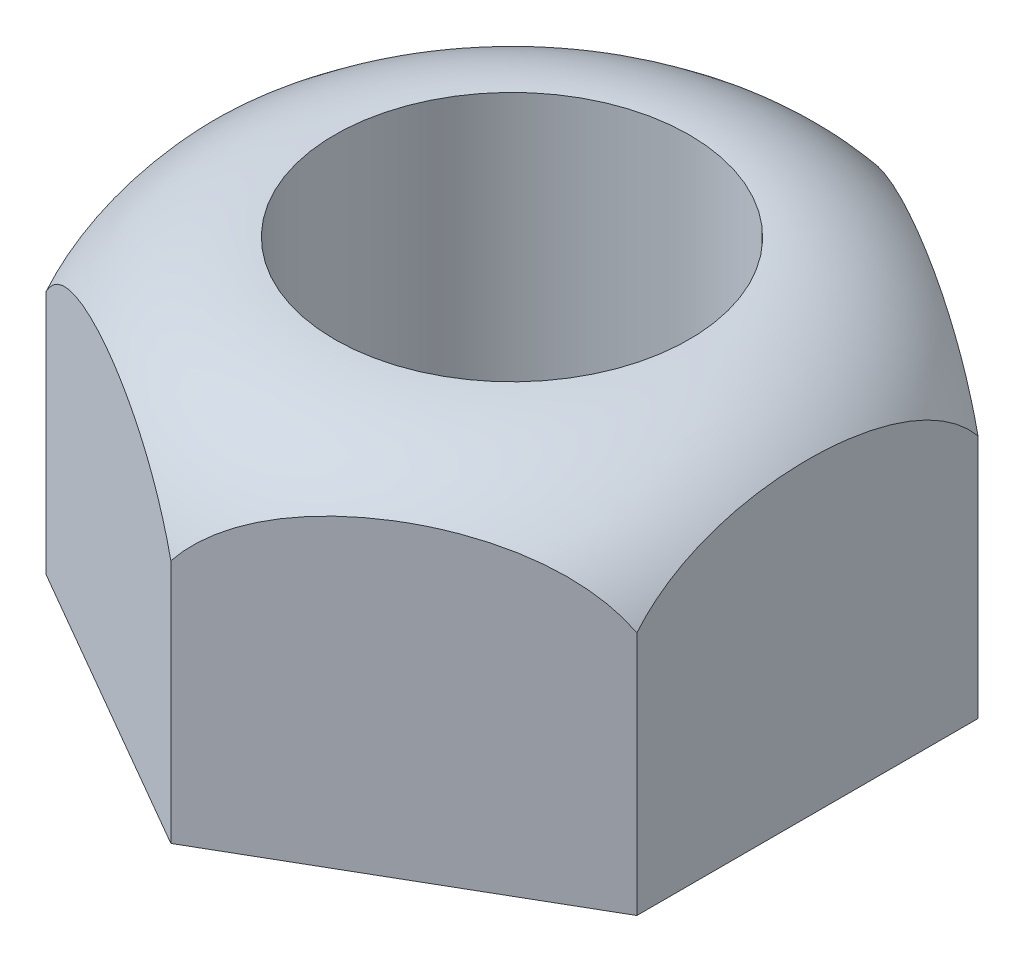
ISO-10303-21;
HEADER;
FILE_DESCRIPTION(('STEP AP214'),'2;1');
FILE_NAME('part.step','',(''),(''),'','','');
FILE_SCHEMA(('AUTOMOTIVE_DESIGN { 1 0 10303 214 1 1 1 1 }'));
ENDSEC;
DATA;
#1=APPLICATION_CONTEXT('core data for automotive mechanical design processes');
#2=APPLICATION_PROTOCOL_DEFINITION('international standard','automotive_design',2000,#1);
#3=PRODUCT_CONTEXT('',#1,'mechanical');
#4=PRODUCT('Part','Part','',(#3));
#5=PRODUCT_RELATED_PRODUCT_CATEGORY('part','',(#4));
#6=PRODUCT_DEFINITION_FORMATION('','',#4);
#7=PRODUCT_DEFINITION_CONTEXT('part definition',#1,'design');
#8=PRODUCT_DEFINITION('design','',#6,#7);
#9=PRODUCT_DEFINITION_SHAPE('','',#8);
#10=(LENGTH_UNIT() NAMED_UNIT(*) SI_UNIT(.MILLI.,.METRE.));
#11=(NAMED_UNIT(*) PLANE_ANGLE_UNIT() SI_UNIT($,.RADIAN.));
#12=(NAMED_UNIT(*) SI_UNIT($,.STERADIAN.) SOLID_ANGLE_UNIT());
#13=UNCERTAINTY_MEASURE_WITH_UNIT(LENGTH_MEASURE(1.E-05),#10,'distance_accuracy_value','');
#14=(GEOMETRIC_REPRESENTATION_CONTEXT(3) GLOBAL_UNCERTAINTY_ASSIGNED_CONTEXT((#13)) GLOBAL_UNIT_ASSIGNED_CONTEXT((#10,
#11,#12)) REPRESENTATION_CONTEXT('',''));
#15=CARTESIAN_POINT('',(0.,0.,0.));
#16=DIRECTION('',(0.,0.,1.));
#17=DIRECTION('',(1.,0.,0.));
#18=AXIS2_PLACEMENT_3D('',#15,#16,#17);
#19=CARTESIAN_POINT('',(0.,-3.,0.));
#20=DIRECTION('',(0.,1.,0.));
#21=DIRECTION('',(0.,0.,1.));
#22=AXIS2_PLACEMENT_3D('',#19,#20,#21);
#23=PLANE('',#22);
#24=DIRECTION('',(0.,0.,-1.));
#25=VECTOR('',#24,1.);
#26=CARTESIAN_POINT('',(4.99999999999999,-3.,2.88675134594813));
#27=LINE('',#26,#25);
#28=CARTESIAN_POINT('',(4.99999999999999,-3.,2.88675134594813));
#29=VERTEX_POINT('',#28);
#30=CARTESIAN_POINT('',(4.99999999999999,-3.,-2.88675134594813));
#31=VERTEX_POINT('',#30);
#32=EDGE_CURVE('E132',#29,#31,#27,.T.);
#33=ORIENTED_EDGE('',*,*,#32,.F.);
#34=DIRECTION('',(0.866025403784439,0.,-0.5));
#35=VECTOR('',#34,1.);
#36=CARTESIAN_POINT('',(0.,-3.,5.77350269189626));
#37=LINE('',#36,#35);
#38=CARTESIAN_POINT('',(0.,-3.,5.77350269189626));
#39=VERTEX_POINT('',#38);
#40=EDGE_CURVE('E121',#39,#29,#37,.T.);
#41=ORIENTED_EDGE('',*,*,#40,.F.);
#42=DIRECTION('',(0.866025403784439,0.,0.5));
#43=VECTOR('',#42,1.);
#44=CARTESIAN_POINT('',(-5.,-3.,2.88675134594813));
#45=LINE('',#44,#43);
#46=CARTESIAN_POINT('',(-5.,-3.,2.88675134594813));
#47=VERTEX_POINT('',#46);
#48=EDGE_CURVE('E123',#47,#39,#45,.T.);
#49=ORIENTED_EDGE('',*,*,#48,.F.);
#50=DIRECTION('',(0.,0.,1.));
#51=VECTOR('',#50,1.);
#52=CARTESIAN_POINT('',(-5.,-3.,-2.88675134594813));
#53=LINE('',#52,#51);
#54=CARTESIAN_POINT('',(-5.,-3.,-2.88675134594813));
#55=VERTEX_POINT('',#54);
#56=EDGE_CURVE('E126',#55,#47,#53,.T.);
#57=ORIENTED_EDGE('',*,*,#56,.F.);
#58=DIRECTION('',(-0.866025403784439,0.,0.5));
#59=VECTOR('',#58,1.);
#60=CARTESIAN_POINT('',(0.,-3.,-5.77350269189626));
#61=LINE('',#60,#59);
#62=CARTESIAN_POINT('',(0.,-3.,-5.77350269189626));
#63=VERTEX_POINT('',#62);
#64=EDGE_CURVE('E129',#63,#55,#61,.T.);
#65=ORIENTED_EDGE('',*,*,#64,.F.);
#66=DIRECTION('',(-0.866025403784439,0.,-0.5));
#67=VECTOR('',#66,1.);
#68=CARTESIAN_POINT('',(4.99999999999999,-3.,-2.88675134594813));
#69=LINE('',#68,#67);
#70=EDGE_CURVE('E112',#31,#63,#69,.T.);
#71=ORIENTED_EDGE('',*,*,#70,.F.);
#72=EDGE_LOOP('',(#33,#41,#49,#57,#65,#71));
#73=FACE_BOUND('',#72,.T.);
#74=CARTESIAN_POINT('',(0.,-3.,0.));
#75=DIRECTION('',(0.,1.,0.));
#76=DIRECTION('',(0.,0.,1.));
#77=AXIS2_PLACEMENT_3D('',#74,#75,#76);
#78=CIRCLE('',#77,3.);
#79=CARTESIAN_POINT('',(0.,-3.,3.));
#80=VERTEX_POINT('',#79);
#81=EDGE_CURVE('E134',#80,#80,#78,.T.);
#82=ORIENTED_EDGE('',*,*,#81,.T.);
#83=EDGE_LOOP('',(#82));
#84=FACE_BOUND('',#83,.T.);
#85=ADVANCED_FACE('F39',(#73,#84),#23,.F.);
#86=CARTESIAN_POINT('',(4.99999999999999,3.,2.88675134594813));
#87=DIRECTION('',(-1.,0.,0.));
#88=DIRECTION('',(0.,0.,1.));
#89=AXIS2_PLACEMENT_3D('',#86,#87,#88);
#90=PLANE('',#89);
#91=DIRECTION('',(0.,-1.,0.));
#92=VECTOR('',#91,1.);
#93=CARTESIAN_POINT('',(4.99999999999999,3.,-2.88675134594813));
#94=LINE('',#93,#92);
#95=CARTESIAN_POINT('',(5.,1.14353960055794,-2.88675134594813));
#96=VERTEX_POINT('',#95);
#97=EDGE_CURVE('E11',#96,#31,#94,.T.);
#98=ORIENTED_EDGE('',*,*,#97,.F.);
#99=CARTESIAN_POINT('',(4.99999999999999,2.23606797749979,0.));
#100=CARTESIAN_POINT('',(4.99999999999999,2.23606547708485,0.120918907635913));
#101=CARTESIAN_POINT('',(4.99999999999999,2.23215695883544,0.241827848779719));
#102=CARTESIAN_POINT('',(4.99999999999999,2.21636735639039,0.483117337858945));
#103=CARTESIAN_POINT('',(4.99999999999999,2.20448748147199,0.603497963153676));
#104=CARTESIAN_POINT('',(4.99999999999999,2.17230957672205,0.843175170668359));
#105=CARTESIAN_POINT('',(4.99999999999999,2.15200965486483,0.962471503081574));
#106=CARTESIAN_POINT('',(4.99999999999999,2.10228318635368,1.19911813128936));
#107=CARTESIAN_POINT('',(4.99999999999999,2.07285946731982,1.31646901815666));
#108=CARTESIAN_POINT('',(4.99999999999999,1.99149257912571,1.59010251201208));
#109=CARTESIAN_POINT('',(4.99999999999999,1.93525457949775,1.74515200180723));
#110=CARTESIAN_POINT('',(4.99999999999999,1.80136991737628,2.04572548254269));
#111=CARTESIAN_POINT('',(4.99999999999999,1.72375539118573,2.19126336952084));
#112=CARTESIAN_POINT('',(4.99999999999999,1.56277118376517,2.43890308689245));
#113=CARTESIAN_POINT('',(4.99999999999999,1.48377397538791,2.54382254430582));
#114=CARTESIAN_POINT('',(4.99999999999999,1.30987699827946,2.7396282799976));
#115=CARTESIAN_POINT('',(4.99999999999999,1.21499717596204,2.83053188858002));
#116=CARTESIAN_POINT('',(4.99999999999999,1.0301159573075,2.97723052563607));
#117=CARTESIAN_POINT('',(4.99999999999999,0.942813107119015,3.0364145149125));
#118=CARTESIAN_POINT('',(4.99999999999999,0.759583936212259,3.13957828549396));
#119=CARTESIAN_POINT('',(4.99999999999999,0.663661656029086,3.18356514439735));
#120=CARTESIAN_POINT('',(4.99999999999999,0.464847484174504,3.25393965352395));
#121=CARTESIAN_POINT('',(4.99999999999999,0.361917437478582,3.28022077701964));
#122=CARTESIAN_POINT('',(4.99999999999999,0.15294111182827,3.31290834387848));
#123=CARTESIAN_POINT('',(4.99999999999999,0.0468962069976227,3.31932342209303));
#124=CARTESIAN_POINT('',(4.99999999999999,-0.153734080318637,3.31222176535418));
#125=CARTESIAN_POINT('',(4.99999999999999,-0.248394487684605,3.30065386765089));
#126=CARTESIAN_POINT('',(4.99999999999999,-0.434404619303879,3.26181910522999));
#127=CARTESIAN_POINT('',(4.99999999999999,-0.525754653885907,3.23455371613119));
#128=CARTESIAN_POINT('',(4.99999999999999,-0.703233395942723,3.16568011577716));
#129=CARTESIAN_POINT('',(4.99999999999999,-0.789340379448156,3.12401645042847));
#130=CARTESIAN_POINT('',(4.99999999999999,-0.954375501924881,3.02836892053913));
#131=CARTESIAN_POINT('',(4.99999999999999,-1.03330025498121,2.97437928682587));
#132=CARTESIAN_POINT('',(4.99999999999999,-1.21217999234046,2.83319578618356));
#133=CARTESIAN_POINT('',(4.99999999999999,-1.30839251775865,2.74125094122274));
#134=CARTESIAN_POINT('',(4.99999999999999,-1.48457457681218,2.54296994059313));
#135=CARTESIAN_POINT('',(4.99999999999999,-1.5645150618035,2.43660860279747));
#136=CARTESIAN_POINT('',(4.99999999999999,-1.73831292997454,2.16830650460945));
#137=CARTESIAN_POINT('',(4.99999999999999,-1.82449575152687,2.0014223589474));
#138=CARTESIAN_POINT('',(4.99999999999999,-1.96979428306982,1.65626349949258));
#139=CARTESIAN_POINT('',(4.99999999999999,-2.0288469548393,1.47796334338487));
#140=CARTESIAN_POINT('',(4.99999999999999,-2.11230706123924,1.15914275681445));
#141=CARTESIAN_POINT('',(4.99999999999999,-2.14163215600666,1.01985771960752));
#142=CARTESIAN_POINT('',(4.99999999999999,-2.18827639288221,0.739223942062745));
#143=CARTESIAN_POINT('',(4.99999999999999,-2.20558839332926,0.597874025064965));
#144=CARTESIAN_POINT('',(4.99999999999999,-2.22908563764715,0.314037780514991));
#145=CARTESIAN_POINT('',(4.99999999999999,-2.2352521116048,0.171549941078096));
#146=CARTESIAN_POINT('',(4.99999999999999,-2.23673283017761,-0.113440619086964));
#147=CARTESIAN_POINT('',(4.99999999999999,-2.23205071801853,-0.255943318753454));
#148=CARTESIAN_POINT('',(4.99999999999999,-2.21317816931042,-0.518018786832451));
#149=CARTESIAN_POINT('',(4.99999999999999,-2.20058157063548,-0.637707348758131));
#150=CARTESIAN_POINT('',(4.99999999999999,-2.16699996802981,-0.875936112436773));
#151=CARTESIAN_POINT('',(4.99999999999999,-2.14601392442707,-0.994476169994405));
#152=CARTESIAN_POINT('',(4.99999999999999,-2.09500227924768,-1.22924960329497));
#153=CARTESIAN_POINT('',(4.99999999999999,-2.06500417832384,-1.34548886578246));
#154=CARTESIAN_POINT('',(4.99999999999999,-1.99503238840018,-1.57487815676775));
#155=CARTESIAN_POINT('',(4.99999999999999,-1.95506445754837,-1.68802992676516));
#156=CARTESIAN_POINT('',(4.99999999999999,-1.85282705434588,-1.93726711187123));
#157=CARTESIAN_POINT('',(4.99999999999999,-1.78748843719083,-2.07212579721777));
#158=CARTESIAN_POINT('',(4.99999999999999,-1.63755093552136,-2.3307739159673));
#159=CARTESIAN_POINT('',(4.99999999999999,-1.55297200147192,-2.45457463159287));
#160=CARTESIAN_POINT('',(4.99999999999999,-1.38203242292518,-2.66253632811602));
#161=CARTESIAN_POINT('',(4.99999999999999,-1.2993405858539,-2.7496924410226));
#162=CARTESIAN_POINT('',(4.99999999999999,-1.12084494282723,-2.909419315686));
#163=CARTESIAN_POINT('',(4.99999999999999,-1.02505637822909,-2.98200679289585));
#164=CARTESIAN_POINT('',(4.99999999999999,-0.838185476698753,-3.0982354091423));
#165=CARTESIAN_POINT('',(4.99999999999999,-0.748838484702114,-3.14465751090598));
#166=CARTESIAN_POINT('',(4.99999999999999,-0.563617831829161,-3.22195881654211));
#167=CARTESIAN_POINT('',(4.99999999999999,-0.467746985968321,-3.25284467656011));
#168=CARTESIAN_POINT('',(4.99999999999999,-0.271626556165446,-3.29731276667061));
#169=CARTESIAN_POINT('',(4.99999999999999,-0.171360951813679,-3.31082509659772));
#170=CARTESIAN_POINT('',(4.99999999999999,0.0299567601643019,-3.31940920815924));
#171=CARTESIAN_POINT('',(4.99999999999999,0.131008734859816,-3.31448404174156));
#172=CARTESIAN_POINT('',(4.99999999999999,0.323626511314792,-3.28751634425651));
#173=CARTESIAN_POINT('',(4.99999999999999,0.415365206264283,-3.26668052657209));
#174=CARTESIAN_POINT('',(4.99999999999999,0.594254757868503,-3.21051142143265));
#175=CARTESIAN_POINT('',(4.99999999999999,0.681405348220315,-3.17517729351067));
#176=CARTESIAN_POINT('',(4.99999999999999,0.852902766659784,-3.08996682861327));
#177=CARTESIAN_POINT('',(4.99999999999999,0.936971260358956,-3.0395342866492));
#178=CARTESIAN_POINT('',(4.99999999999999,1.09690441917607,-2.92708168680618));
#179=CARTESIAN_POINT('',(4.99999999999999,1.1727653643736,-2.86505640918113));
#180=CARTESIAN_POINT('',(4.99999999999999,1.34862628219194,-2.70091379330323));
#181=CARTESIAN_POINT('',(4.99999999999999,1.44367677918478,-2.59347912144342));
#182=CARTESIAN_POINT('',(4.99999999999999,1.61523047085954,-2.3646875635332));
#183=CARTESIAN_POINT('',(4.99999999999999,1.69168854122065,-2.2432978383347));
#184=CARTESIAN_POINT('',(4.99999999999999,1.85813802690555,-1.93419060871512));
#185=CARTESIAN_POINT('',(4.99999999999999,1.93857989311894,-1.74132926635834));
#186=CARTESIAN_POINT('',(4.99999999999999,2.03604362805079,-1.44490972333349));
#187=CARTESIAN_POINT('',(4.99999999999999,2.06468018171814,-1.3448228636016));
#188=CARTESIAN_POINT('',(4.99999999999999,2.11488760022331,-1.14288449210295));
#189=CARTESIAN_POINT('',(4.99999999999999,2.13645992156809,-1.04103334866254));
#190=CARTESIAN_POINT('',(4.99999999999999,2.18243116291176,-0.783859414389841));
#191=CARTESIAN_POINT('',(4.99999999999999,2.20264847587348,-0.627789688123208));
#192=CARTESIAN_POINT('',(4.99999999999999,2.22947043045928,-0.314474570572886));
#193=CARTESIAN_POINT('',(4.99999999999999,2.23607122874808,-0.157228859927116));
#194=CARTESIAN_POINT('',(4.99999999999999,2.23606797749979,0.));
#195=B_SPLINE_CURVE_WITH_KNOTS('',3,(#99,#100,#101,#102,#103,#104,#105,#106,#107,#108,#109,#110,
#111,#112,#113,#114,#115,#116,#117,#118,#119,#120,#121,#122,#123,#124,#125,#126,#127,#128,#129,
#130,#131,#132,#133,#134,#135,#136,#137,#138,#139,#140,#141,#142,#143,#144,#145,#146,#147,#148,
#149,#150,#151,#152,#153,#154,#155,#156,#157,#158,#159,#160,#161,#162,#163,#164,#165,#166,#167,
#168,#169,#170,#171,#172,#173,#174,#175,#176,#177,#178,#179,#180,#181,#182,#183,#184,#185,#186,
#187,#188,#189,#190,#191,#192,#193,#194),.UNSPECIFIED.,.T.,.F.,(4,2,2,2,2,2,2,2,2,2,2,2,2,2,2,2,
2,2,2,2,2,2,2,2,2,2,2,2,2,2,2,2,2,2,2,2,2,2,2,2,2,2,2,2,2,2,2,4),(0.,0.362673965901397,
0.72529292557616,1.08799341168277,1.45058160289177,1.94401806167096,2.43671672640692,
2.82932144264359,3.22143674955952,3.53657847104138,3.8515732264426,4.16844661865274,
4.48518226130435,4.76990781469742,5.05460660726683,5.34041435089636,5.6263561421647,
6.02338925123516,6.42112504006141,6.98148877350558,7.54314803489807,7.96962891026468,
8.39636310741747,8.8238152901349,9.25112394455638,9.611905094895,9.97273096933659,
10.3324667643941,10.6919952705368,11.1401969679133,11.5879360221887,11.9470202530772,
12.3056901001392,12.6064755350347,12.9071319953369,13.2089943614697,13.5108067627123,
13.791757368672,14.072724263638,14.3656805716756,14.6587691054092,15.0866864035578,
15.5156321286721,16.1388153709031,16.4509640992346,16.7630484280037,17.2344943502383,
17.7060733224502),.UNSPECIFIED.);
#196=CARTESIAN_POINT('',(5.,1.14353960055794,2.88675134594813));
#197=VERTEX_POINT('',#196);
#198=EDGE_CURVE('E97',#96,#197,#195,.T.);
#199=ORIENTED_EDGE('',*,*,#198,.T.);
#200=DIRECTION('',(0.,-1.,0.));
#201=VECTOR('',#200,1.);
#202=CARTESIAN_POINT('',(4.99999999999999,3.,2.88675134594813));
#203=LINE('',#202,#201);
#204=EDGE_CURVE('E63',#197,#29,#203,.T.);
#205=ORIENTED_EDGE('',*,*,#204,.T.);
#206=ORIENTED_EDGE('',*,*,#32,.T.);
#207=EDGE_LOOP('',(#98,#199,#205,#206));
#208=FACE_BOUND('',#207,.T.);
#209=ADVANCED_FACE('F41',(#208),#90,.F.);
#210=CARTESIAN_POINT('',(4.99999999999999,3.,-2.88675134594813));
#211=DIRECTION('',(-0.5,0.,0.866025403784439));
#212=DIRECTION('',(0.866025403784439,0.,0.5));
#213=AXIS2_PLACEMENT_3D('',#210,#211,#212);
#214=PLANE('',#213);
#215=DIRECTION('',(0.,-1.,0.));
#216=VECTOR('',#215,1.);
#217=CARTESIAN_POINT('',(0.,3.,-5.77350269189626));
#218=LINE('',#217,#216);
#219=CARTESIAN_POINT('',(0.,1.14353960055794,-5.77350269189626));
#220=VERTEX_POINT('',#219);
#221=EDGE_CURVE('E48',#220,#63,#218,.T.);
#222=ORIENTED_EDGE('',*,*,#221,.F.);
#223=CARTESIAN_POINT('',(-0.000142810290228146,1.14333960055794,-5.77358514345576));
#224=CARTESIAN_POINT('',(0.0893124367608543,1.26853746801625,-5.72193813249039));
#225=CARTESIAN_POINT('',(0.190281036219496,1.38106208917785,-5.66364388441325));
#226=CARTESIAN_POINT('',(0.407192690678229,1.58081776284459,-5.53840988232113));
#227=CARTESIAN_POINT('',(0.522887072573814,1.66840452885689,-5.47161369978999));
#228=CARTESIAN_POINT('',(0.800973119005675,1.8453618653456,-5.31106064602468));
#229=CARTESIAN_POINT('',(0.966868613847032,1.92718000731215,-5.21528083742067));
#230=CARTESIAN_POINT('',(1.30867200266892,2.06044665989698,-5.01794055887443));
#231=CARTESIAN_POINT('',(1.48464915509275,2.11164793833912,-4.91634010255131));
#232=CARTESIAN_POINT('',(1.79145018682874,2.17711091081525,-4.73920844429088));
#233=CARTESIAN_POINT('',(1.92132792676049,2.19766815653355,-4.66422349617955));
#234=CARTESIAN_POINT('',(2.18219334190964,2.22609275762975,-4.51361277852092));
#235=CARTESIAN_POINT('',(2.31318159389259,2.23395305381997,-4.43798667597788));
#236=CARTESIAN_POINT('',(2.57506109966329,2.23743805351204,-4.28679047282592));
#237=CARTESIAN_POINT('',(2.70595216180202,2.23308274414345,-4.21122048286561));
#238=CARTESIAN_POINT('',(2.96690448797829,2.21191397733964,-4.06055958710208));
#239=CARTESIAN_POINT('',(3.09696617716107,2.19510752531275,-3.98546843584115));
#240=CARTESIAN_POINT('',(3.40008780053761,2.13995147605242,-3.8104610849875));
#241=CARTESIAN_POINT('',(3.57244496899929,2.09615790937785,-3.71095062737939));
#242=CARTESIAN_POINT('',(3.9098954373457,1.98015119492548,-3.51612350864143));
#243=CARTESIAN_POINT('',(4.07500016298977,1.90798467322086,-3.42080025084634));
#244=CARTESIAN_POINT('',(4.34810663584005,1.75430816427858,-3.2631221552288));
#245=CARTESIAN_POINT('',(4.45941552985277,1.68069324538259,-3.19885793530736));
#246=CARTESIAN_POINT('',(4.6702948231368,1.51399060964207,-3.07710671856331));
#247=CARTESIAN_POINT('',(4.7699080013148,1.42097754781097,-3.01959502332741));
#248=CARTESIAN_POINT('',(4.90999536744939,1.26268968281893,-2.93871554477953));
#249=CARTESIAN_POINT('',(4.95652867353715,1.20445511317756,-2.91184952798348));
#250=CARTESIAN_POINT('',(5.00014281029023,1.14333960055794,-2.88666889438862));
#251=B_SPLINE_CURVE_WITH_KNOTS('',3,(#223,#224,#225,#226,#227,#228,#229,#230,#231,#232,#233,
#234,#235,#236,#237,#238,#239,#240,#241,#242,#243,#244,#245,#246,#247,#248,#249,#250),
.UNSPECIFIED.,.F.,.F.,(4,2,2,2,2,2,2,2,2,2,2,2,2,4),(0.,0.483993268461521,0.960690674025162,
1.58230674436584,2.20887687993225,2.66247501095778,3.1163252445534,3.56943332344352,
4.02228666275751,4.63192059230963,5.24055685286809,5.68346282766207,6.12469470637231,
6.36206056069102),.UNSPECIFIED.);
#252=EDGE_CURVE('E92',#220,#96,#251,.T.);
#253=ORIENTED_EDGE('',*,*,#252,.T.);
#254=ORIENTED_EDGE('',*,*,#97,.T.);
#255=ORIENTED_EDGE('',*,*,#70,.T.);
#256=EDGE_LOOP('',(#222,#253,#254,#255));
#257=FACE_BOUND('',#256,.T.);
#258=ADVANCED_FACE('F110',(#257),#214,.F.);
#259=CARTESIAN_POINT('',(0.,3.,-5.77350269189626));
#260=DIRECTION('',(0.5,0.,0.866025403784438));
#261=DIRECTION('',(0.866025403784439,0.,-0.5));
#262=AXIS2_PLACEMENT_3D('',#259,#260,#261);
#263=PLANE('',#262);
#264=DIRECTION('',(0.,-1.,0.));
#265=VECTOR('',#264,1.);
#266=CARTESIAN_POINT('',(-5.,3.,-2.88675134594813));
#267=LINE('',#266,#265);
#268=CARTESIAN_POINT('',(-5.,1.14353960055794,-2.88675134594813));
#269=VERTEX_POINT('',#268);
#270=EDGE_CURVE('E107',#269,#55,#267,.T.);
#271=ORIENTED_EDGE('',*,*,#270,.F.);
#272=CARTESIAN_POINT('',(-5.00014281029022,1.14333960055794,-2.88666889438863));
#273=CARTESIAN_POINT('',(-4.91068756323914,1.26853746801625,-2.93831590535399));
#274=CARTESIAN_POINT('',(-4.8097189637805,1.38106208917785,-2.99661015343114));
#275=CARTESIAN_POINT('',(-4.59280730932177,1.58081776284459,-3.12184415552326));
#276=CARTESIAN_POINT('',(-4.47711292742618,1.66840452885689,-3.1886403380544));
#277=CARTESIAN_POINT('',(-4.19902688099432,1.8453618653456,-3.34919339181971));
#278=CARTESIAN_POINT('',(-4.03313138615296,1.92718000731214,-3.44497320042372));
#279=CARTESIAN_POINT('',(-3.69132799733107,2.06044665989698,-3.64231347896996));
#280=CARTESIAN_POINT('',(-3.51535084490724,2.11164793833912,-3.74391393529309));
#281=CARTESIAN_POINT('',(-3.20854981317126,2.17711091081525,-3.92104559355351));
#282=CARTESIAN_POINT('',(-3.07867207323951,2.19766815653355,-3.99603054166485));
#283=CARTESIAN_POINT('',(-2.81780665809036,2.22609275762975,-4.14664125932347));
#284=CARTESIAN_POINT('',(-2.68681840610741,2.23395305381997,-4.22226736186651));
#285=CARTESIAN_POINT('',(-2.42493890033671,2.23743805351204,-4.37346356501847));
#286=CARTESIAN_POINT('',(-2.29404783819798,2.23308274414345,-4.44903355497878));
#287=CARTESIAN_POINT('',(-2.03309551202171,2.21191397733964,-4.59969445074231));
#288=CARTESIAN_POINT('',(-1.90303382283893,2.19510752531275,-4.67478560200324));
#289=CARTESIAN_POINT('',(-1.59991219946238,2.13995147605242,-4.84979295285689));
#290=CARTESIAN_POINT('',(-1.4275550310007,2.09615790937785,-4.949303410465));
#291=CARTESIAN_POINT('',(-1.0901045626543,1.98015119492548,-5.14413052920296));
#292=CARTESIAN_POINT('',(-0.924999837010228,1.90798467322086,-5.23945378699805));
#293=CARTESIAN_POINT('',(-0.651893364159947,1.75430816427858,-5.39713188261558));
#294=CARTESIAN_POINT('',(-0.540584470147226,1.68069324538258,-5.46139610253703));
#295=CARTESIAN_POINT('',(-0.329705176863198,1.51399060964207,-5.58314731928108));
#296=CARTESIAN_POINT('',(-0.230091998685199,1.42097754781097,-5.64065901451698));
#297=CARTESIAN_POINT('',(-0.0900046325506105,1.26268968281893,-5.72153849306485));
#298=CARTESIAN_POINT('',(-0.0434713264628498,1.20445511317756,-5.7484045098609));
#299=CARTESIAN_POINT('',(0.000142810290220696,1.14333960055794,-5.77358514345576));
#300=B_SPLINE_CURVE_WITH_KNOTS('',3,(#272,#273,#274,#275,#276,#277,#278,#279,#280,#281,#282,
#283,#284,#285,#286,#287,#288,#289,#290,#291,#292,#293,#294,#295,#296,#297,#298,#299),
.UNSPECIFIED.,.F.,.F.,(4,2,2,2,2,2,2,2,2,2,2,2,2,4),(0.,0.48399326846152,0.960690674025162,
1.58230674436584,2.20887687993225,2.66247501095778,3.1163252445534,3.56943332344352,
4.02228666275751,4.63192059230963,5.24055685286808,5.68346282766206,6.1246947063723,
6.36206056069101),.UNSPECIFIED.);
#301=EDGE_CURVE('E95',#269,#220,#300,.T.);
#302=ORIENTED_EDGE('',*,*,#301,.T.);
#303=ORIENTED_EDGE('',*,*,#221,.T.);
#304=ORIENTED_EDGE('',*,*,#64,.T.);
#305=EDGE_LOOP('',(#271,#302,#303,#304));
#306=FACE_BOUND('',#305,.T.);
#307=ADVANCED_FACE('F104',(#306),#263,.F.);
#308=CARTESIAN_POINT('',(-5.,3.,-2.88675134594813));
#309=DIRECTION('',(1.,0.,0.));
#310=DIRECTION('',(0.,0.,-1.));
#311=AXIS2_PLACEMENT_3D('',#308,#309,#310);
#312=PLANE('',#311);
#313=DIRECTION('',(0.,-1.,0.));
#314=VECTOR('',#313,1.);
#315=CARTESIAN_POINT('',(-5.,3.,2.88675134594813));
#316=LINE('',#315,#314);
#317=CARTESIAN_POINT('',(-5.,1.14353960055794,2.88675134594813));
#318=VERTEX_POINT('',#317);
#319=EDGE_CURVE('E114',#318,#47,#316,.T.);
#320=ORIENTED_EDGE('',*,*,#319,.F.);
#321=CARTESIAN_POINT('',(-5.,2.23606797749979,0.));
#322=CARTESIAN_POINT('',(-5.,2.23606547708484,-0.120918907635912));
#323=CARTESIAN_POINT('',(-5.,2.23215695883543,-0.241827848779718));
#324=CARTESIAN_POINT('',(-5.,2.21636735639038,-0.483117337858945));
#325=CARTESIAN_POINT('',(-5.,2.20448748147198,-0.603497963153676));
#326=CARTESIAN_POINT('',(-5.,2.17230957672204,-0.84317517066836));
#327=CARTESIAN_POINT('',(-5.,2.15200965486482,-0.962471503081576));
#328=CARTESIAN_POINT('',(-5.,2.10228318635367,-1.19911813128937));
#329=CARTESIAN_POINT('',(-5.,2.07285946731981,-1.31646901815666));
#330=CARTESIAN_POINT('',(-5.,1.9914925791257,-1.59010251201208));
#331=CARTESIAN_POINT('',(-5.,1.93525457949774,-1.74515200180724));
#332=CARTESIAN_POINT('',(-5.,1.80136991737627,-2.04572548254269));
#333=CARTESIAN_POINT('',(-5.,1.72375539118572,-2.19126336952084));
#334=CARTESIAN_POINT('',(-5.,1.56277118376516,-2.43890308689245));
#335=CARTESIAN_POINT('',(-5.,1.4837739753879,-2.54382254430581));
#336=CARTESIAN_POINT('',(-5.,1.30987699827945,-2.73962827999759));
#337=CARTESIAN_POINT('',(-5.,1.21499717596203,-2.83053188858002));
#338=CARTESIAN_POINT('',(-5.,1.0301159573075,-2.97723052563607));
#339=CARTESIAN_POINT('',(-5.,0.942813107119006,-3.03641451491249));
#340=CARTESIAN_POINT('',(-5.,0.75958393621225,-3.13957828549395));
#341=CARTESIAN_POINT('',(-5.,0.663661656029078,-3.18356514439734));
#342=CARTESIAN_POINT('',(-5.,0.464847484174497,-3.25393965352394));
#343=CARTESIAN_POINT('',(-5.,0.361917437478576,-3.28022077701963));
#344=CARTESIAN_POINT('',(-5.,0.152941111828265,-3.31290834387847));
#345=CARTESIAN_POINT('',(-5.,0.0468962069976182,-3.31932342209301));
#346=CARTESIAN_POINT('',(-5.,-0.153734080318641,-3.31222176535417));
#347=CARTESIAN_POINT('',(-5.,-0.248394487684607,-3.30065386765088));
#348=CARTESIAN_POINT('',(-5.,-0.43440461930388,-3.26181910522997));
#349=CARTESIAN_POINT('',(-5.,-0.525754653885909,-3.23455371613117));
#350=CARTESIAN_POINT('',(-5.,-0.703233395942724,-3.16568011577715));
#351=CARTESIAN_POINT('',(-5.,-0.789340379448155,-3.12401645042845));
#352=CARTESIAN_POINT('',(-5.,-0.95437550192488,-3.02836892053912));
#353=CARTESIAN_POINT('',(-5.,-1.03330025498121,-2.97437928682585));
#354=CARTESIAN_POINT('',(-5.,-1.21217999234046,-2.83319578618354));
#355=CARTESIAN_POINT('',(-5.,-1.30839251775865,-2.74125094122272));
#356=CARTESIAN_POINT('',(-5.,-1.48457457681218,-2.54296994059312));
#357=CARTESIAN_POINT('',(-5.,-1.56451506180349,-2.43660860279746));
#358=CARTESIAN_POINT('',(-5.,-1.73831292997453,-2.16830650460943));
#359=CARTESIAN_POINT('',(-5.,-1.82449575152686,-2.00142235894739));
#360=CARTESIAN_POINT('',(-5.,-1.96979428306981,-1.65626349949257));
#361=CARTESIAN_POINT('',(-5.,-2.0288469548393,-1.47796334338485));
#362=CARTESIAN_POINT('',(-5.,-2.11230706123924,-1.15914275681443));
#363=CARTESIAN_POINT('',(-5.,-2.14163215600665,-1.01985771960751));
#364=CARTESIAN_POINT('',(-5.,-2.1882763928822,-0.739223942062733));
#365=CARTESIAN_POINT('',(-5.,-2.20558839332925,-0.597874025064953));
#366=CARTESIAN_POINT('',(-5.,-2.22908563764714,-0.31403778051498));
#367=CARTESIAN_POINT('',(-5.,-2.2352521116048,-0.171549941078086));
#368=CARTESIAN_POINT('',(-5.,-2.23673283017761,0.113440619086973));
#369=CARTESIAN_POINT('',(-5.,-2.23205071801852,0.255943318753463));
#370=CARTESIAN_POINT('',(-5.,-2.21317816931041,0.518018786832457));
#371=CARTESIAN_POINT('',(-5.,-2.20058157063547,0.637707348758135));
#372=CARTESIAN_POINT('',(-5.,-2.1669999680298,0.875936112436775));
#373=CARTESIAN_POINT('',(-5.,-2.14601392442707,0.994476169994407));
#374=CARTESIAN_POINT('',(-5.,-2.09500227924767,1.22924960329497));
#375=CARTESIAN_POINT('',(-5.,-2.06500417832383,1.34548886578246));
#376=CARTESIAN_POINT('',(-5.,-1.99503238840017,1.57487815676774));
#377=CARTESIAN_POINT('',(-5.,-1.95506445754836,1.68802992676515));
#378=CARTESIAN_POINT('',(-5.,-1.85282705434587,1.93726711187123));
#379=CARTESIAN_POINT('',(-5.,-1.78748843719082,2.07212579721776));
#380=CARTESIAN_POINT('',(-5.,-1.63755093552136,2.33077391596729));
#381=CARTESIAN_POINT('',(-5.,-1.55297200147191,2.45457463159286));
#382=CARTESIAN_POINT('',(-5.,-1.38203242292517,2.66253632811601));
#383=CARTESIAN_POINT('',(-5.,-1.29934058585389,2.74969244102259));
#384=CARTESIAN_POINT('',(-5.,-1.12084494282722,2.90941931568599));
#385=CARTESIAN_POINT('',(-5.,-1.02505637822909,2.98200679289584));
#386=CARTESIAN_POINT('',(-5.,-0.838185476698747,3.09823540914229));
#387=CARTESIAN_POINT('',(-5.,-0.748838484702108,3.14465751090597));
#388=CARTESIAN_POINT('',(-5.,-0.563617831829155,3.22195881654209));
#389=CARTESIAN_POINT('',(-5.,-0.467746985968316,3.2528446765601));
#390=CARTESIAN_POINT('',(-5.,-0.271626556165443,3.2973127666706));
#391=CARTESIAN_POINT('',(-5.,-0.171360951813676,3.31082509659771));
#392=CARTESIAN_POINT('',(-5.,0.0299567601643046,3.31940920815922));
#393=CARTESIAN_POINT('',(-5.,0.131008734859818,3.31448404174155));
#394=CARTESIAN_POINT('',(-5.,0.323626511314793,3.28751634425649));
#395=CARTESIAN_POINT('',(-5.,0.415365206264284,3.26668052657207));
#396=CARTESIAN_POINT('',(-5.,0.594254757868503,3.21051142143263));
#397=CARTESIAN_POINT('',(-5.,0.681405348220314,3.17517729351065));
#398=CARTESIAN_POINT('',(-5.,0.852902766659783,3.08996682861325));
#399=CARTESIAN_POINT('',(-5.,0.936971260358954,3.03953428664919));
#400=CARTESIAN_POINT('',(-5.,1.09690441917607,2.92708168680616));
#401=CARTESIAN_POINT('',(-5.,1.1727653643736,2.86505640918111));
#402=CARTESIAN_POINT('',(-5.,1.34862628219193,2.70091379330321));
#403=CARTESIAN_POINT('',(-5.,1.44367677918477,2.5934791214434));
#404=CARTESIAN_POINT('',(-5.,1.61523047085954,2.36468756353319));
#405=CARTESIAN_POINT('',(-5.,1.69168854122064,2.24329783833468));
#406=CARTESIAN_POINT('',(-5.,1.85813802690555,1.93419060871511));
#407=CARTESIAN_POINT('',(-5.00000000000001,1.93857989311893,1.74132926635832));
#408=CARTESIAN_POINT('',(-5.,2.03604362805078,1.44490972333348));
#409=CARTESIAN_POINT('',(-5.,2.06468018171813,1.34482286360159));
#410=CARTESIAN_POINT('',(-5.,2.1148876002233,1.14288449210294));
#411=CARTESIAN_POINT('',(-5.,2.13645992156808,1.04103334866253));
#412=CARTESIAN_POINT('',(-5.,2.18243116291176,0.783859414389831));
#413=CARTESIAN_POINT('',(-5.,2.20264847587347,0.627789688123201));
#414=CARTESIAN_POINT('',(-5.,2.22947043045927,0.314474570572883));
#415=CARTESIAN_POINT('',(-5.,2.23607122874807,0.157228859927116));
#416=CARTESIAN_POINT('',(-5.,2.23606797749979,0.));
#417=B_SPLINE_CURVE_WITH_KNOTS('',3,(#321,#322,#323,#324,#325,#326,#327,#328,#329,#330,#331,
#332,#333,#334,#335,#336,#337,#338,#339,#340,#341,#342,#343,#344,#345,#346,#347,#348,#349,#350,
#351,#352,#353,#354,#355,#356,#357,#358,#359,#360,#361,#362,#363,#364,#365,#366,#367,#368,#369,
#370,#371,#372,#373,#374,#375,#376,#377,#378,#379,#380,#381,#382,#383,#384,#385,#386,#387,#388,
#389,#390,#391,#392,#393,#394,#395,#396,#397,#398,#399,#400,#401,#402,#403,#404,#405,#406,#407,
#408,#409,#410,#411,#412,#413,#414,#415,#416),.UNSPECIFIED.,.T.,.F.,(4,2,2,2,2,2,2,2,2,2,2,2,2,
2,2,2,2,2,2,2,2,2,2,2,2,2,2,2,2,2,2,2,2,2,2,2,2,2,2,2,2,2,2,2,2,2,2,4),(0.,0.362673965901398,
0.725292925576163,1.08799341168277,1.45058160289177,1.94401806167097,2.43671672640692,
2.82932144264359,3.22143674955951,3.53657847104137,3.8515732264426,4.16844661865273,
4.48518226130434,4.7699078146974,5.05460660726682,5.34041435089634,5.62635614216469,
6.02338925123514,6.4211250400614,6.98148877350556,7.54314803489805,7.96962891026466,
8.39636310741745,8.82381529013488,9.25112394455636,9.61190509489497,9.97273096933656,
10.332466764394,10.6919952705367,11.1401969679133,11.5879360221887,11.9470202530772,
12.3056901001392,12.6064755350347,12.9071319953368,13.2089943614696,13.5108067627122,
13.7917573686719,14.072724263638,14.3656805716756,14.6587691054091,15.0866864035577,
15.515632128672,16.1388153709031,16.4509640992346,16.7630484280036,17.2344943502383,
17.7060733224501),.UNSPECIFIED.);
#418=EDGE_CURVE('E108',#318,#269,#417,.T.);
#419=ORIENTED_EDGE('',*,*,#418,.T.);
#420=ORIENTED_EDGE('',*,*,#270,.T.);
#421=ORIENTED_EDGE('',*,*,#56,.T.);
#422=EDGE_LOOP('',(#320,#419,#420,#421));
#423=FACE_BOUND('',#422,.T.);
#424=ADVANCED_FACE('F182',(#423),#312,.F.);
#425=CARTESIAN_POINT('',(-5.,3.,2.88675134594813));
#426=DIRECTION('',(0.5,0.,-0.866025403784439));
#427=DIRECTION('',(-0.866025403784439,0.,-0.5));
#428=AXIS2_PLACEMENT_3D('',#425,#426,#427);
#429=PLANE('',#428);
#430=DIRECTION('',(0.,-1.,0.));
#431=VECTOR('',#430,1.);
#432=CARTESIAN_POINT('',(0.,3.,5.77350269189626));
#433=LINE('',#432,#431);
#434=CARTESIAN_POINT('',(0.,1.14353960055794,5.77350269189626));
#435=VERTEX_POINT('',#434);
#436=EDGE_CURVE('E118',#435,#39,#433,.T.);
#437=ORIENTED_EDGE('',*,*,#436,.F.);
#438=CARTESIAN_POINT('',(0.000142810290220453,1.14333960055794,5.77358514345576));
#439=CARTESIAN_POINT('',(-0.0893124367608628,1.26853746801625,5.7219381324904));
#440=CARTESIAN_POINT('',(-0.190281036219505,1.38106208917785,5.66364388441325));
#441=CARTESIAN_POINT('',(-0.407192690678238,1.58081776284459,5.53840988232113));
#442=CARTESIAN_POINT('',(-0.522887072573822,1.66840452885689,5.47161369978999));
#443=CARTESIAN_POINT('',(-0.800973119005683,1.8453618653456,5.31106064602468));
#444=CARTESIAN_POINT('',(-0.966868613847041,1.92718000731215,5.21528083742067));
#445=CARTESIAN_POINT('',(-1.30867200266893,2.06044665989698,5.01794055887443));
#446=CARTESIAN_POINT('',(-1.48464915509276,2.11164793833912,4.9163401025513));
#447=CARTESIAN_POINT('',(-1.79145018682875,2.17711091081525,4.73920844429088));
#448=CARTESIAN_POINT('',(-1.9213279267605,2.19766815653355,4.66422349617954));
#449=CARTESIAN_POINT('',(-2.18219334190965,2.22609275762975,4.51361277852092));
#450=CARTESIAN_POINT('',(-2.3131815938926,2.23395305381997,4.43798667597788));
#451=CARTESIAN_POINT('',(-2.5750610996633,2.23743805351204,4.28679047282592));
#452=CARTESIAN_POINT('',(-2.70595216180203,2.23308274414345,4.21122048286561));
#453=CARTESIAN_POINT('',(-2.9669044879783,2.21191397733964,4.06055958710208));
#454=CARTESIAN_POINT('',(-3.09696617716108,2.19510752531274,3.98546843584115));
#455=CARTESIAN_POINT('',(-3.40008780053762,2.13995147605242,3.8104610849875));
#456=CARTESIAN_POINT('',(-3.5724449689993,2.09615790937785,3.71095062737939));
#457=CARTESIAN_POINT('',(-3.9098954373457,1.98015119492547,3.51612350864143));
#458=CARTESIAN_POINT('',(-4.07500016298978,1.90798467322085,3.42080025084634));
#459=CARTESIAN_POINT('',(-4.34810663584006,1.75430816427858,3.26312215522881));
#460=CARTESIAN_POINT('',(-4.45941552985278,1.68069324538258,3.19885793530736));
#461=CARTESIAN_POINT('',(-4.6702948231368,1.51399060964207,3.07710671856331));
#462=CARTESIAN_POINT('',(-4.7699080013148,1.42097754781096,3.01959502332741));
#463=CARTESIAN_POINT('',(-4.90999536744939,1.26268968281893,2.93871554477954));
#464=CARTESIAN_POINT('',(-4.95652867353715,1.20445511317756,2.91184952798349));
#465=CARTESIAN_POINT('',(-5.00014281029022,1.14333960055794,2.88666889438863));
#466=B_SPLINE_CURVE_WITH_KNOTS('',3,(#438,#439,#440,#441,#442,#443,#444,#445,#446,#447,#448,
#449,#450,#451,#452,#453,#454,#455,#456,#457,#458,#459,#460,#461,#462,#463,#464,#465),
.UNSPECIFIED.,.F.,.F.,(4,2,2,2,2,2,2,2,2,2,2,2,2,4),(0.,0.483993268461521,0.960690674025162,
1.58230674436584,2.20887687993225,2.66247501095778,3.1163252445534,3.56943332344352,
4.02228666275751,4.63192059230963,5.24055685286808,5.68346282766206,6.1246947063723,
6.362060560691),.UNSPECIFIED.);
#467=EDGE_CURVE('E55',#435,#318,#466,.T.);
#468=ORIENTED_EDGE('',*,*,#467,.T.);
#469=ORIENTED_EDGE('',*,*,#319,.T.);
#470=ORIENTED_EDGE('',*,*,#48,.T.);
#471=EDGE_LOOP('',(#437,#468,#469,#470));
#472=FACE_BOUND('',#471,.T.);
#473=ADVANCED_FACE('F199',(#472),#429,.F.);
#474=CARTESIAN_POINT('',(0.,3.,5.77350269189626));
#475=DIRECTION('',(-0.5,0.,-0.866025403784439));
#476=DIRECTION('',(-0.866025403784439,0.,0.5));
#477=AXIS2_PLACEMENT_3D('',#474,#475,#476);
#478=PLANE('',#477);
#479=ORIENTED_EDGE('',*,*,#204,.F.);
#480=CARTESIAN_POINT('',(5.00014281029022,1.14333960055794,2.88666889438863));
#481=CARTESIAN_POINT('',(4.91068756323914,1.26853746801625,2.93831590535399));
#482=CARTESIAN_POINT('',(4.8097189637805,1.38106208917785,2.99661015343114));
#483=CARTESIAN_POINT('',(4.59280730932177,1.58081776284459,3.12184415552326));
#484=CARTESIAN_POINT('',(4.47711292742618,1.66840452885689,3.1886403380544));
#485=CARTESIAN_POINT('',(4.19902688099432,1.8453618653456,3.34919339181971));
#486=CARTESIAN_POINT('',(4.03313138615296,1.92718000731214,3.44497320042372));
#487=CARTESIAN_POINT('',(3.69132799733108,2.06044665989698,3.64231347896996));
#488=CARTESIAN_POINT('',(3.51535084490724,2.11164793833912,3.74391393529308));
#489=CARTESIAN_POINT('',(3.20854981317126,2.17711091081525,3.92104559355351));
#490=CARTESIAN_POINT('',(3.07867207323951,2.19766815653355,3.99603054166485));
#491=CARTESIAN_POINT('',(2.81780665809036,2.22609275762975,4.14664125932347));
#492=CARTESIAN_POINT('',(2.68681840610741,2.23395305381997,4.22226736186651));
#493=CARTESIAN_POINT('',(2.42493890033671,2.23743805351204,4.37346356501847));
#494=CARTESIAN_POINT('',(2.29404783819798,2.23308274414345,4.44903355497878));
#495=CARTESIAN_POINT('',(2.03309551202171,2.21191397733964,4.59969445074231));
#496=CARTESIAN_POINT('',(1.90303382283892,2.19510752531275,4.67478560200324));
#497=CARTESIAN_POINT('',(1.59991219946238,2.13995147605242,4.84979295285689));
#498=CARTESIAN_POINT('',(1.4275550310007,2.09615790937785,4.949303410465));
#499=CARTESIAN_POINT('',(1.0901045626543,1.98015119492548,5.14413052920296));
#500=CARTESIAN_POINT('',(0.924999837010223,1.90798467322086,5.23945378699804));
#501=CARTESIAN_POINT('',(0.651893364159942,1.75430816427858,5.39713188261558));
#502=CARTESIAN_POINT('',(0.540584470147222,1.68069324538259,5.46139610253703));
#503=CARTESIAN_POINT('',(0.329705176863194,1.51399060964207,5.58314731928108));
#504=CARTESIAN_POINT('',(0.230091998685194,1.42097754781097,5.64065901451698));
#505=CARTESIAN_POINT('',(0.0900046325506047,1.26268968281893,5.72153849306485));
#506=CARTESIAN_POINT('',(0.0434713264628437,1.20445511317756,5.7484045098609));
#507=CARTESIAN_POINT('',(-0.000142810290227179,1.14333960055794,5.77358514345576));
#508=B_SPLINE_CURVE_WITH_KNOTS('',3,(#480,#481,#482,#483,#484,#485,#486,#487,#488,#489,#490,
#491,#492,#493,#494,#495,#496,#497,#498,#499,#500,#501,#502,#503,#504,#505,#506,#507),
.UNSPECIFIED.,.F.,.F.,(4,2,2,2,2,2,2,2,2,2,2,2,2,4),(0.,0.48399326846152,0.960690674025162,
1.58230674436584,2.20887687993225,2.66247501095778,3.11632524455341,3.56943332344352,
4.02228666275752,4.63192059230963,5.24055685286808,5.68346282766206,6.1246947063723,
6.36206056069101),.UNSPECIFIED.);
#509=EDGE_CURVE('E154',#197,#435,#508,.T.);
#510=ORIENTED_EDGE('',*,*,#509,.T.);
#511=ORIENTED_EDGE('',*,*,#436,.T.);
#512=ORIENTED_EDGE('',*,*,#40,.T.);
#513=EDGE_LOOP('',(#479,#510,#511,#512));
#514=FACE_BOUND('',#513,.T.);
#515=ADVANCED_FACE('F196',(#514),#478,.F.);
#516=CARTESIAN_POINT('',(0.,3.,0.));
#517=DIRECTION('',(0.,-1.,0.));
#518=DIRECTION('',(0.,0.,-1.));
#519=AXIS2_PLACEMENT_3D('',#516,#517,#518);
#520=CYLINDRICAL_SURFACE('',#519,3.);
#521=CARTESIAN_POINT('',(0.,3.,0.));
#522=DIRECTION('',(0.,-1.,0.));
#523=DIRECTION('',(0.,0.,-1.));
#524=AXIS2_PLACEMENT_3D('',#521,#522,#523);
#525=CIRCLE('',#524,3.);
#526=CARTESIAN_POINT('',(0.,3.,-3.));
#527=VERTEX_POINT('',#526);
#528=EDGE_CURVE('E212',#527,#527,#525,.T.);
#529=ORIENTED_EDGE('',*,*,#528,.F.);
#530=EDGE_LOOP('',(#529));
#531=FACE_BOUND('',#530,.T.);
#532=ORIENTED_EDGE('',*,*,#81,.F.);
#533=EDGE_LOOP('',(#532));
#534=FACE_BOUND('',#533,.T.);
#535=ADVANCED_FACE('F148',(#531,#534),#520,.F.);
#536=CARTESIAN_POINT('',(0.,0.,0.));
#537=DIRECTION('',(0.,-1.,0.));
#538=DIRECTION('',(0.,0.,-1.));
#539=AXIS2_PLACEMENT_3D('',#536,#537,#538);
#540=TOROIDAL_SURFACE('',#539,3.,3.);
#541=ORIENTED_EDGE('',*,*,#528,.T.);
#542=EDGE_LOOP('',(#541));
#543=FACE_BOUND('',#542,.T.);
#544=ORIENTED_EDGE('',*,*,#252,.F.);
#545=ORIENTED_EDGE('',*,*,#301,.F.);
#546=ORIENTED_EDGE('',*,*,#418,.F.);
#547=ORIENTED_EDGE('',*,*,#467,.F.);
#548=ORIENTED_EDGE('',*,*,#509,.F.);
#549=ORIENTED_EDGE('',*,*,#198,.F.);
#550=EDGE_LOOP('',(#544,#545,#546,#547,#548,#549));
#551=FACE_BOUND('',#550,.T.);
#552=ADVANCED_FACE('F94',(#543,#551),#540,.T.);
#553=CLOSED_SHELL('',(#85,#209,#258,#307,#424,#473,#515,#535,#552));
#554=MANIFOLD_SOLID_BREP('B2',#553);
#555=ADVANCED_BREP_SHAPE_REPRESENTATION('',(#18,#554),#14);
#556=SHAPE_DEFINITION_REPRESENTATION(#9,#555);
ENDSEC;
END-ISO-10303-21;
